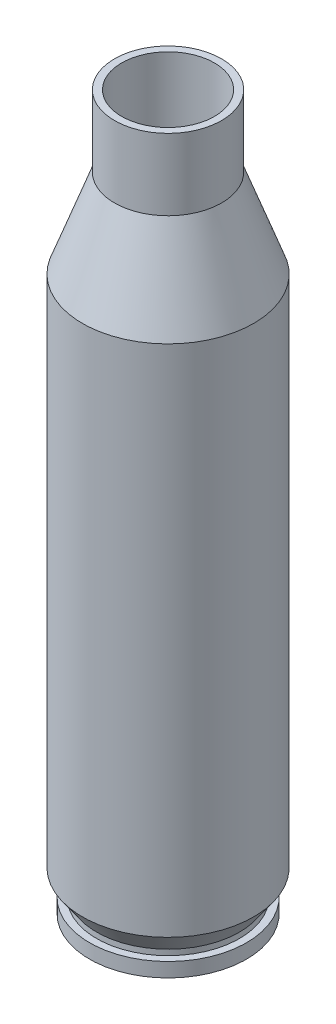
ISO-10303-21;
HEADER;
FILE_DESCRIPTION(('STEP AP214'),'2;1');
FILE_NAME('part.step','',(''),(''),'','','');
FILE_SCHEMA(('AUTOMOTIVE_DESIGN { 1 0 10303 214 1 1 1 1 }'));
ENDSEC;
DATA;
#1=APPLICATION_CONTEXT('core data for automotive mechanical design processes');
#2=APPLICATION_PROTOCOL_DEFINITION('international standard','automotive_design',2000,#1);
#3=PRODUCT_CONTEXT('',#1,'mechanical');
#4=PRODUCT('Part','Part','',(#3));
#5=PRODUCT_RELATED_PRODUCT_CATEGORY('part','',(#4));
#6=PRODUCT_DEFINITION_FORMATION('','',#4);
#7=PRODUCT_DEFINITION_CONTEXT('part definition',#1,'design');
#8=PRODUCT_DEFINITION('design','',#6,#7);
#9=PRODUCT_DEFINITION_SHAPE('','',#8);
#10=(LENGTH_UNIT() NAMED_UNIT(*) SI_UNIT(.MILLI.,.METRE.));
#11=(NAMED_UNIT(*) PLANE_ANGLE_UNIT() SI_UNIT($,.RADIAN.));
#12=(NAMED_UNIT(*) SI_UNIT($,.STERADIAN.) SOLID_ANGLE_UNIT());
#13=UNCERTAINTY_MEASURE_WITH_UNIT(LENGTH_MEASURE(1.E-05),#10,'distance_accuracy_value','');
#14=(GEOMETRIC_REPRESENTATION_CONTEXT(3) GLOBAL_UNCERTAINTY_ASSIGNED_CONTEXT((#13)) GLOBAL_UNIT_ASSIGNED_CONTEXT((#10,
#11,#12)) REPRESENTATION_CONTEXT('',''));
#15=CARTESIAN_POINT('',(0.,0.,0.));
#16=DIRECTION('',(0.,0.,1.));
#17=DIRECTION('',(1.,0.,0.));
#18=AXIS2_PLACEMENT_3D('',#15,#16,#17);
#19=CARTESIAN_POINT('',(0.,0.,0.));
#20=DIRECTION('',(0.,-1.,0.));
#21=DIRECTION('',(0.,0.,-1.));
#22=AXIS2_PLACEMENT_3D('',#19,#20,#21);
#23=CYLINDRICAL_SURFACE('',#22,3.25000000000001);
#24=CARTESIAN_POINT('',(0.,50.,0.));
#25=DIRECTION('',(0.,-1.,0.));
#26=DIRECTION('',(0.,0.,-1.));
#27=AXIS2_PLACEMENT_3D('',#24,#25,#26);
#28=CIRCLE('',#27,3.25000000000001);
#29=CARTESIAN_POINT('',(0.,50.,-3.25000000000001));
#30=VERTEX_POINT('',#29);
#31=EDGE_CURVE('E10',#30,#30,#28,.T.);
#32=ORIENTED_EDGE('',*,*,#31,.F.);
#33=EDGE_LOOP('',(#32));
#34=FACE_BOUND('',#33,.T.);
#35=CARTESIAN_POINT('',(0.,44.9118365096458,0.));
#36=DIRECTION('',(0.,-1.,0.));
#37=DIRECTION('',(0.,0.,-1.));
#38=AXIS2_PLACEMENT_3D('',#35,#36,#37);
#39=CIRCLE('',#38,3.25000000000001);
#40=CARTESIAN_POINT('',(0.,44.9118365096458,-3.25000000000001));
#41=VERTEX_POINT('',#40);
#42=EDGE_CURVE('E77',#41,#41,#39,.T.);
#43=ORIENTED_EDGE('',*,*,#42,.T.);
#44=EDGE_LOOP('',(#43));
#45=FACE_BOUND('',#44,.T.);
#46=ADVANCED_FACE('F31',(#34,#45),#23,.F.);
#47=CARTESIAN_POINT('',(-3.25000000000001,50.,0.));
#48=DIRECTION('',(0.,-1.,0.));
#49=DIRECTION('',(0.,0.,-1.));
#50=AXIS2_PLACEMENT_3D('',#47,#48,#49);
#51=PLANE('',#50);
#52=CARTESIAN_POINT('',(0.,50.,0.));
#53=DIRECTION('',(0.,-1.,0.));
#54=DIRECTION('',(0.,0.,-1.));
#55=AXIS2_PLACEMENT_3D('',#52,#53,#54);
#56=CIRCLE('',#55,3.75000000000001);
#57=CARTESIAN_POINT('',(0.,50.,-3.75000000000001));
#58=VERTEX_POINT('',#57);
#59=EDGE_CURVE('E37',#58,#58,#56,.T.);
#60=ORIENTED_EDGE('',*,*,#59,.F.);
#61=EDGE_LOOP('',(#60));
#62=FACE_BOUND('',#61,.T.);
#63=ORIENTED_EDGE('',*,*,#31,.T.);
#64=EDGE_LOOP('',(#63));
#65=FACE_BOUND('',#64,.T.);
#66=ADVANCED_FACE('F117',(#62,#65),#51,.F.);
#67=CARTESIAN_POINT('',(0.,0.,0.));
#68=DIRECTION('',(0.,-1.,0.));
#69=DIRECTION('',(0.,0.,-1.));
#70=AXIS2_PLACEMENT_3D('',#67,#68,#69);
#71=CYLINDRICAL_SURFACE('',#70,3.75000000000001);
#72=CARTESIAN_POINT('',(0.,45.,0.));
#73=DIRECTION('',(0.,-1.,0.));
#74=DIRECTION('',(0.,0.,-1.));
#75=AXIS2_PLACEMENT_3D('',#72,#73,#74);
#76=CIRCLE('',#75,3.75000000000001);
#77=CARTESIAN_POINT('',(0.,45.,-3.75000000000001));
#78=VERTEX_POINT('',#77);
#79=EDGE_CURVE('E41',#78,#78,#76,.T.);
#80=ORIENTED_EDGE('',*,*,#79,.F.);
#81=EDGE_LOOP('',(#80));
#82=FACE_BOUND('',#81,.T.);
#83=ORIENTED_EDGE('',*,*,#59,.T.);
#84=EDGE_LOOP('',(#83));
#85=FACE_BOUND('',#84,.T.);
#86=ADVANCED_FACE('F122',(#82,#85),#71,.T.);
#87=CARTESIAN_POINT('',(0.,45.,0.));
#88=DIRECTION('',(0.,-1.,0.));
#89=DIRECTION('',(0.,0.,-1.));
#90=AXIS2_PLACEMENT_3D('',#87,#88,#89);
#91=CONICAL_SURFACE('',#90,3.75000000000001,0.349065850398866);
#92=CARTESIAN_POINT('',(0.,38.8181758062271,0.));
#93=DIRECTION('',(0.,-1.,0.));
#94=DIRECTION('',(0.,0.,-1.));
#95=AXIS2_PLACEMENT_3D('',#92,#93,#94);
#96=CIRCLE('',#95,6.);
#97=CARTESIAN_POINT('',(0.,38.8181758062271,-6.));
#98=VERTEX_POINT('',#97);
#99=EDGE_CURVE('E45',#98,#98,#96,.T.);
#100=ORIENTED_EDGE('',*,*,#99,.F.);
#101=EDGE_LOOP('',(#100));
#102=FACE_BOUND('',#101,.T.);
#103=ORIENTED_EDGE('',*,*,#79,.T.);
#104=EDGE_LOOP('',(#103));
#105=FACE_BOUND('',#104,.T.);
#106=ADVANCED_FACE('F127',(#102,#105),#91,.T.);
#107=CARTESIAN_POINT('',(0.,0.,0.));
#108=DIRECTION('',(0.,-1.,0.));
#109=DIRECTION('',(0.,0.,-1.));
#110=AXIS2_PLACEMENT_3D('',#107,#108,#109);
#111=CYLINDRICAL_SURFACE('',#110,6.);
#112=CARTESIAN_POINT('',(0.,2.81817580622713,0.));
#113=DIRECTION('',(0.,-1.,0.));
#114=DIRECTION('',(0.,0.,-1.));
#115=AXIS2_PLACEMENT_3D('',#112,#113,#114);
#116=CIRCLE('',#115,6.);
#117=CARTESIAN_POINT('',(0.,2.81817580622713,-6.));
#118=VERTEX_POINT('',#117);
#119=EDGE_CURVE('E50',#118,#118,#116,.T.);
#120=ORIENTED_EDGE('',*,*,#119,.F.);
#121=EDGE_LOOP('',(#120));
#122=FACE_BOUND('',#121,.T.);
#123=ORIENTED_EDGE('',*,*,#99,.T.);
#124=EDGE_LOOP('',(#123));
#125=FACE_BOUND('',#124,.T.);
#126=ADVANCED_FACE('F133',(#122,#125),#111,.T.);
#127=CARTESIAN_POINT('',(0.,2.81817580622713,0.));
#128=DIRECTION('',(0.,1.,0.));
#129=DIRECTION('',(0.,0.,1.));
#130=AXIS2_PLACEMENT_3D('',#127,#128,#129);
#131=CONICAL_SURFACE('',#130,6.,0.610865238198017);
#132=CARTESIAN_POINT('',(0.,1.39002779948501,0.));
#133=DIRECTION('',(0.,-1.,0.));
#134=DIRECTION('',(0.,0.,-1.));
#135=AXIS2_PLACEMENT_3D('',#132,#133,#134);
#136=CIRCLE('',#135,5.);
#137=CARTESIAN_POINT('',(0.,1.39002779948501,-5.));
#138=VERTEX_POINT('',#137);
#139=EDGE_CURVE('E53',#138,#138,#136,.T.);
#140=ORIENTED_EDGE('',*,*,#139,.F.);
#141=EDGE_LOOP('',(#140));
#142=FACE_BOUND('',#141,.T.);
#143=ORIENTED_EDGE('',*,*,#119,.T.);
#144=EDGE_LOOP('',(#143));
#145=FACE_BOUND('',#144,.T.);
#146=ADVANCED_FACE('F137',(#142,#145),#131,.T.);
#147=CARTESIAN_POINT('',(0.,0.,0.));
#148=DIRECTION('',(0.,-1.,0.));
#149=DIRECTION('',(0.,0.,-1.));
#150=AXIS2_PLACEMENT_3D('',#147,#148,#149);
#151=CYLINDRICAL_SURFACE('',#150,5.);
#152=CARTESIAN_POINT('',(0.,1.,0.));
#153=DIRECTION('',(0.,-1.,0.));
#154=DIRECTION('',(0.,0.,-1.));
#155=AXIS2_PLACEMENT_3D('',#152,#153,#154);
#156=CIRCLE('',#155,5.);
#157=CARTESIAN_POINT('',(0.,1.,-5.));
#158=VERTEX_POINT('',#157);
#159=EDGE_CURVE('E56',#158,#158,#156,.T.);
#160=ORIENTED_EDGE('',*,*,#159,.F.);
#161=EDGE_LOOP('',(#160));
#162=FACE_BOUND('',#161,.T.);
#163=ORIENTED_EDGE('',*,*,#139,.T.);
#164=EDGE_LOOP('',(#163));
#165=FACE_BOUND('',#164,.T.);
#166=ADVANCED_FACE('F141',(#162,#165),#151,.T.);
#167=CARTESIAN_POINT('',(-5.5,1.,0.));
#168=DIRECTION('',(0.,-1.,0.));
#169=DIRECTION('',(0.,0.,-1.));
#170=AXIS2_PLACEMENT_3D('',#167,#168,#169);
#171=PLANE('',#170);
#172=CARTESIAN_POINT('',(0.,1.,0.));
#173=DIRECTION('',(0.,-1.,0.));
#174=DIRECTION('',(0.,0.,-1.));
#175=AXIS2_PLACEMENT_3D('',#172,#173,#174);
#176=CIRCLE('',#175,5.5);
#177=CARTESIAN_POINT('',(0.,1.,-5.5));
#178=VERTEX_POINT('',#177);
#179=EDGE_CURVE('E59',#178,#178,#176,.T.);
#180=ORIENTED_EDGE('',*,*,#179,.F.);
#181=EDGE_LOOP('',(#180));
#182=FACE_BOUND('',#181,.T.);
#183=ORIENTED_EDGE('',*,*,#159,.T.);
#184=EDGE_LOOP('',(#183));
#185=FACE_BOUND('',#184,.T.);
#186=ADVANCED_FACE('F145',(#182,#185),#171,.F.);
#187=CARTESIAN_POINT('',(0.,0.,0.));
#188=DIRECTION('',(0.,-1.,0.));
#189=DIRECTION('',(0.,0.,-1.));
#190=AXIS2_PLACEMENT_3D('',#187,#188,#189);
#191=CYLINDRICAL_SURFACE('',#190,5.5);
#192=CARTESIAN_POINT('',(0.,0.,0.));
#193=DIRECTION('',(0.,-1.,0.));
#194=DIRECTION('',(0.,0.,-1.));
#195=AXIS2_PLACEMENT_3D('',#192,#193,#194);
#196=CIRCLE('',#195,5.5);
#197=CARTESIAN_POINT('',(0.,0.,-5.5));
#198=VERTEX_POINT('',#197);
#199=EDGE_CURVE('E62',#198,#198,#196,.T.);
#200=ORIENTED_EDGE('',*,*,#199,.F.);
#201=EDGE_LOOP('',(#200));
#202=FACE_BOUND('',#201,.T.);
#203=ORIENTED_EDGE('',*,*,#179,.T.);
#204=EDGE_LOOP('',(#203));
#205=FACE_BOUND('',#204,.T.);
#206=ADVANCED_FACE('F113',(#202,#205),#191,.T.);
#207=CARTESIAN_POINT('',(0.,0.,0.));
#208=DIRECTION('',(0.,1.,0.));
#209=DIRECTION('',(0.,0.,1.));
#210=AXIS2_PLACEMENT_3D('',#207,#208,#209);
#211=PLANE('',#210);
#212=ORIENTED_EDGE('',*,*,#199,.T.);
#213=EDGE_LOOP('',(#212));
#214=FACE_BOUND('',#213,.T.);
#215=ADVANCED_FACE('F108',(#214),#211,.F.);
#216=CARTESIAN_POINT('',(-4.38961270561927,1.,0.));
#217=DIRECTION('',(0.,-1.,0.));
#218=DIRECTION('',(0.,0.,-1.));
#219=AXIS2_PLACEMENT_3D('',#216,#217,#218);
#220=PLANE('',#219);
#221=CARTESIAN_POINT('',(0.,1.,0.));
#222=DIRECTION('',(0.,-1.,0.));
#223=DIRECTION('',(0.,0.,-1.));
#224=AXIS2_PLACEMENT_3D('',#221,#222,#223);
#225=CIRCLE('',#224,4.38961270561927);
#226=CARTESIAN_POINT('',(0.,1.,-4.38961270561927));
#227=VERTEX_POINT('',#226);
#228=EDGE_CURVE('E65',#227,#227,#225,.T.);
#229=ORIENTED_EDGE('',*,*,#228,.F.);
#230=EDGE_LOOP('',(#229));
#231=FACE_BOUND('',#230,.T.);
#232=ADVANCED_FACE('F103',(#231),#220,.F.);
#233=CARTESIAN_POINT('',(0.,0.,0.));
#234=DIRECTION('',(0.,-1.,0.));
#235=DIRECTION('',(0.,0.,-1.));
#236=AXIS2_PLACEMENT_3D('',#233,#234,#235);
#237=CYLINDRICAL_SURFACE('',#236,4.38961270561927);
#238=CARTESIAN_POINT('',(0.,1.39002779948501,0.));
#239=DIRECTION('',(0.,-1.,0.));
#240=DIRECTION('',(0.,0.,-1.));
#241=AXIS2_PLACEMENT_3D('',#238,#239,#240);
#242=CIRCLE('',#241,4.38961270561927);
#243=CARTESIAN_POINT('',(0.,1.39002779948501,-4.38961270561927));
#244=VERTEX_POINT('',#243);
#245=EDGE_CURVE('E68',#244,#244,#242,.T.);
#246=ORIENTED_EDGE('',*,*,#245,.F.);
#247=EDGE_LOOP('',(#246));
#248=FACE_BOUND('',#247,.T.);
#249=ORIENTED_EDGE('',*,*,#228,.T.);
#250=EDGE_LOOP('',(#249));
#251=FACE_BOUND('',#250,.T.);
#252=ADVANCED_FACE('F97',(#248,#251),#237,.F.);
#253=CARTESIAN_POINT('',(0.,1.39002779948501,0.));
#254=DIRECTION('',(0.,1.,0.));
#255=DIRECTION('',(0.,0.,1.));
#256=AXIS2_PLACEMENT_3D('',#253,#254,#255);
#257=CONICAL_SURFACE('',#256,4.38961270561927,0.610865238198017);
#258=CARTESIAN_POINT('',(0.,2.81817580622713,0.));
#259=DIRECTION('',(0.,-1.,0.));
#260=DIRECTION('',(0.,0.,-1.));
#261=AXIS2_PLACEMENT_3D('',#258,#259,#260);
#262=CIRCLE('',#261,5.38961270561927);
#263=CARTESIAN_POINT('',(0.,2.81817580622713,-5.38961270561927));
#264=VERTEX_POINT('',#263);
#265=EDGE_CURVE('E71',#264,#264,#262,.T.);
#266=ORIENTED_EDGE('',*,*,#265,.F.);
#267=EDGE_LOOP('',(#266));
#268=FACE_BOUND('',#267,.T.);
#269=ORIENTED_EDGE('',*,*,#245,.T.);
#270=EDGE_LOOP('',(#269));
#271=FACE_BOUND('',#270,.T.);
#272=ADVANCED_FACE('F91',(#268,#271),#257,.F.);
#273=CARTESIAN_POINT('',(0.,0.,0.));
#274=DIRECTION('',(0.,-1.,0.));
#275=DIRECTION('',(0.,0.,-1.));
#276=AXIS2_PLACEMENT_3D('',#273,#274,#275);
#277=CYLINDRICAL_SURFACE('',#276,5.38961270561927);
#278=CARTESIAN_POINT('',(0.,39.0332989145786,0.));
#279=DIRECTION('',(0.,-1.,0.));
#280=DIRECTION('',(0.,0.,-1.));
#281=AXIS2_PLACEMENT_3D('',#278,#279,#280);
#282=CIRCLE('',#281,5.38961270561927);
#283=CARTESIAN_POINT('',(0.,39.0332989145786,-5.38961270561927));
#284=VERTEX_POINT('',#283);
#285=EDGE_CURVE('E74',#284,#284,#282,.T.);
#286=ORIENTED_EDGE('',*,*,#285,.F.);
#287=EDGE_LOOP('',(#286));
#288=FACE_BOUND('',#287,.T.);
#289=ORIENTED_EDGE('',*,*,#265,.T.);
#290=EDGE_LOOP('',(#289));
#291=FACE_BOUND('',#290,.T.);
#292=ADVANCED_FACE('F85',(#288,#291),#277,.F.);
#293=CARTESIAN_POINT('',(0.,39.0332989145786,0.));
#294=DIRECTION('',(0.,-1.,0.));
#295=DIRECTION('',(0.,0.,-1.));
#296=AXIS2_PLACEMENT_3D('',#293,#294,#295);
#297=CONICAL_SURFACE('',#296,5.38961270561927,0.349065850398867);
#298=ORIENTED_EDGE('',*,*,#42,.F.);
#299=EDGE_LOOP('',(#298));
#300=FACE_BOUND('',#299,.T.);
#301=ORIENTED_EDGE('',*,*,#285,.T.);
#302=EDGE_LOOP('',(#301));
#303=FACE_BOUND('',#302,.T.);
#304=ADVANCED_FACE('F82',(#300,#303),#297,.F.);
#305=CLOSED_SHELL('',(#46,#66,#86,#106,#126,#146,#166,#186,#206,#215,#232,#252,#272,#292,#304));
#306=MANIFOLD_SOLID_BREP('B2',#305);
#307=ADVANCED_BREP_SHAPE_REPRESENTATION('',(#18,#306),#14);
#308=SHAPE_DEFINITION_REPRESENTATION(#9,#307);
ENDSEC;
END-ISO-10303-21;
